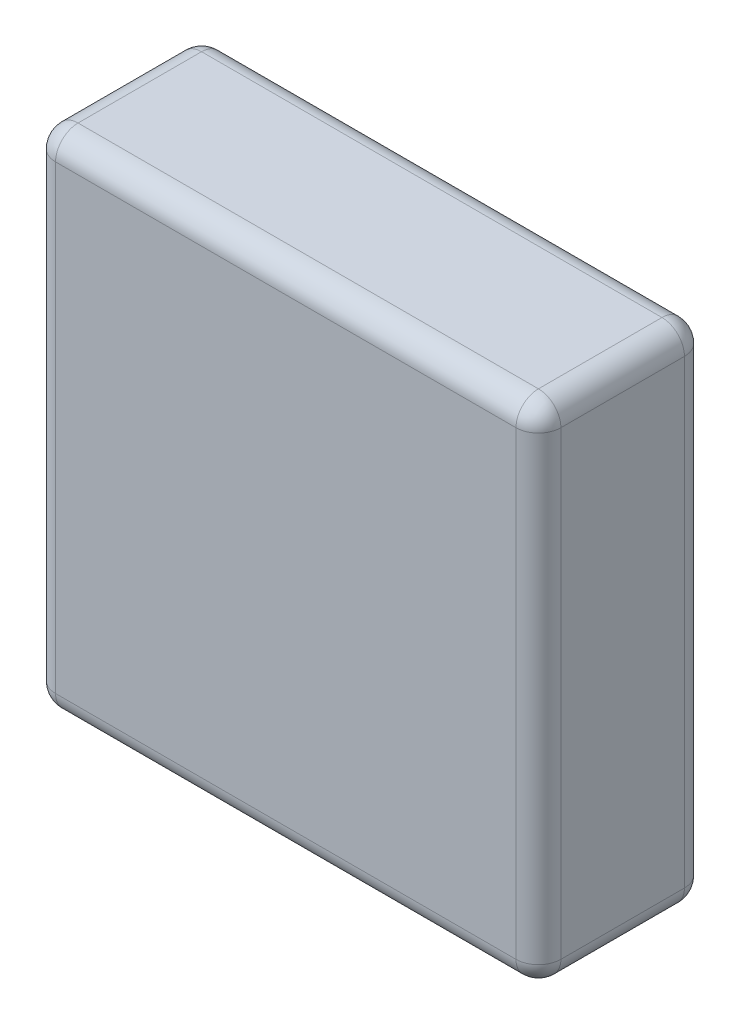
ISO-10303-21;
HEADER;
FILE_DESCRIPTION(('STEP AP214'),'2;1');
FILE_NAME('part.step','',(''),(''),'','','');
FILE_SCHEMA(('AUTOMOTIVE_DESIGN { 1 0 10303 214 1 1 1 1 }'));
ENDSEC;
DATA;
#1=APPLICATION_CONTEXT('core data for automotive mechanical design processes');
#2=APPLICATION_PROTOCOL_DEFINITION('international standard','automotive_design',2000,#1);
#3=PRODUCT_CONTEXT('',#1,'mechanical');
#4=PRODUCT('Part','Part','',(#3));
#5=PRODUCT_RELATED_PRODUCT_CATEGORY('part','',(#4));
#6=PRODUCT_DEFINITION_FORMATION('','',#4);
#7=PRODUCT_DEFINITION_CONTEXT('part definition',#1,'design');
#8=PRODUCT_DEFINITION('design','',#6,#7);
#9=PRODUCT_DEFINITION_SHAPE('','',#8);
#10=(LENGTH_UNIT() NAMED_UNIT(*) SI_UNIT(.MILLI.,.METRE.));
#11=(NAMED_UNIT(*) PLANE_ANGLE_UNIT() SI_UNIT($,.RADIAN.));
#12=(NAMED_UNIT(*) SI_UNIT($,.STERADIAN.) SOLID_ANGLE_UNIT());
#13=UNCERTAINTY_MEASURE_WITH_UNIT(LENGTH_MEASURE(1.E-05),#10,'distance_accuracy_value','');
#14=(GEOMETRIC_REPRESENTATION_CONTEXT(3) GLOBAL_UNCERTAINTY_ASSIGNED_CONTEXT((#13)) GLOBAL_UNIT_ASSIGNED_CONTEXT((#10,
#11,#12)) REPRESENTATION_CONTEXT('',''));
#15=CARTESIAN_POINT('',(0.,0.,0.));
#16=DIRECTION('',(0.,0.,1.));
#17=DIRECTION('',(1.,0.,0.));
#18=AXIS2_PLACEMENT_3D('',#15,#16,#17);
#19=CARTESIAN_POINT('',(45.,-45.,30.));
#20=DIRECTION('',(-1.,0.,0.));
#21=DIRECTION('',(0.,0.,1.));
#22=AXIS2_PLACEMENT_3D('',#19,#20,#21);
#23=PLANE('',#22);
#24=DIRECTION('',(0.,0.,-1.));
#25=VECTOR('',#24,1.);
#26=CARTESIAN_POINT('',(45.,-41.,30.));
#27=LINE('',#26,#25);
#28=CARTESIAN_POINT('',(45.,-41.,26.));
#29=VERTEX_POINT('',#28);
#30=CARTESIAN_POINT('',(45.,-41.,4.));
#31=VERTEX_POINT('',#30);
#32=EDGE_CURVE('E200',#29,#31,#27,.T.);
#33=ORIENTED_EDGE('',*,*,#32,.T.);
#34=DIRECTION('',(0.,1.,0.));
#35=VECTOR('',#34,1.);
#36=CARTESIAN_POINT('',(45.,45.,4.));
#37=LINE('',#36,#35);
#38=CARTESIAN_POINT('',(45.,41.,4.));
#39=VERTEX_POINT('',#38);
#40=EDGE_CURVE('E207',#31,#39,#37,.T.);
#41=ORIENTED_EDGE('',*,*,#40,.T.);
#42=DIRECTION('',(0.,0.,-1.));
#43=VECTOR('',#42,1.);
#44=CARTESIAN_POINT('',(45.,41.,30.));
#45=LINE('',#44,#43);
#46=CARTESIAN_POINT('',(45.,41.,26.));
#47=VERTEX_POINT('',#46);
#48=EDGE_CURVE('E203',#39,#47,#45,.F.);
#49=ORIENTED_EDGE('',*,*,#48,.T.);
#50=DIRECTION('',(0.,1.,0.));
#51=VECTOR('',#50,1.);
#52=CARTESIAN_POINT('',(45.,-45.,26.));
#53=LINE('',#52,#51);
#54=EDGE_CURVE('E197',#47,#29,#53,.F.);
#55=ORIENTED_EDGE('',*,*,#54,.T.);
#56=EDGE_LOOP('',(#33,#41,#49,#55));
#57=FACE_BOUND('',#56,.T.);
#58=ADVANCED_FACE('F45',(#57),#23,.F.);
#59=CARTESIAN_POINT('',(-45.,45.,30.));
#60=DIRECTION('',(0.,-1.,0.));
#61=DIRECTION('',(0.,0.,-1.));
#62=AXIS2_PLACEMENT_3D('',#59,#60,#61);
#63=PLANE('',#62);
#64=DIRECTION('',(0.,0.,-1.));
#65=VECTOR('',#64,1.);
#66=CARTESIAN_POINT('',(41.,45.,30.));
#67=LINE('',#66,#65);
#68=CARTESIAN_POINT('',(41.,45.,26.));
#69=VERTEX_POINT('',#68);
#70=CARTESIAN_POINT('',(41.,45.,4.));
#71=VERTEX_POINT('',#70);
#72=EDGE_CURVE('E187',#69,#71,#67,.T.);
#73=ORIENTED_EDGE('',*,*,#72,.T.);
#74=DIRECTION('',(-1.,0.,0.));
#75=VECTOR('',#74,1.);
#76=CARTESIAN_POINT('',(-45.,45.,4.));
#77=LINE('',#76,#75);
#78=CARTESIAN_POINT('',(-41.,45.,4.));
#79=VERTEX_POINT('',#78);
#80=EDGE_CURVE('E194',#71,#79,#77,.T.);
#81=ORIENTED_EDGE('',*,*,#80,.T.);
#82=DIRECTION('',(0.,0.,-1.));
#83=VECTOR('',#82,1.);
#84=CARTESIAN_POINT('',(-41.,45.,30.));
#85=LINE('',#84,#83);
#86=CARTESIAN_POINT('',(-41.,45.,26.));
#87=VERTEX_POINT('',#86);
#88=EDGE_CURVE('E190',#79,#87,#85,.F.);
#89=ORIENTED_EDGE('',*,*,#88,.T.);
#90=DIRECTION('',(-1.,0.,0.));
#91=VECTOR('',#90,1.);
#92=CARTESIAN_POINT('',(-45.,45.,26.));
#93=LINE('',#92,#91);
#94=EDGE_CURVE('E184',#87,#69,#93,.F.);
#95=ORIENTED_EDGE('',*,*,#94,.T.);
#96=EDGE_LOOP('',(#73,#81,#89,#95));
#97=FACE_BOUND('',#96,.T.);
#98=ADVANCED_FACE('F364',(#97),#63,.F.);
#99=CARTESIAN_POINT('',(-45.,-45.,30.));
#100=DIRECTION('',(1.,0.,0.));
#101=DIRECTION('',(0.,0.,-1.));
#102=AXIS2_PLACEMENT_3D('',#99,#100,#101);
#103=PLANE('',#102);
#104=DIRECTION('',(0.,0.,-1.));
#105=VECTOR('',#104,1.);
#106=CARTESIAN_POINT('',(-45.,41.,30.));
#107=LINE('',#106,#105);
#108=CARTESIAN_POINT('',(-45.,41.,26.));
#109=VERTEX_POINT('',#108);
#110=CARTESIAN_POINT('',(-45.,41.,4.));
#111=VERTEX_POINT('',#110);
#112=EDGE_CURVE('E146',#109,#111,#107,.T.);
#113=ORIENTED_EDGE('',*,*,#112,.T.);
#114=DIRECTION('',(0.,-1.,0.));
#115=VECTOR('',#114,1.);
#116=CARTESIAN_POINT('',(-45.,-45.,4.));
#117=LINE('',#116,#115);
#118=CARTESIAN_POINT('',(-45.,-41.,4.));
#119=VERTEX_POINT('',#118);
#120=EDGE_CURVE('E141',#111,#119,#117,.T.);
#121=ORIENTED_EDGE('',*,*,#120,.T.);
#122=DIRECTION('',(0.,0.,-1.));
#123=VECTOR('',#122,1.);
#124=CARTESIAN_POINT('',(-45.,-41.,30.));
#125=LINE('',#124,#123);
#126=CARTESIAN_POINT('',(-45.,-41.,26.));
#127=VERTEX_POINT('',#126);
#128=EDGE_CURVE('E133',#119,#127,#125,.F.);
#129=ORIENTED_EDGE('',*,*,#128,.T.);
#130=DIRECTION('',(0.,-1.,0.));
#131=VECTOR('',#130,1.);
#132=CARTESIAN_POINT('',(-45.,-45.,26.));
#133=LINE('',#132,#131);
#134=EDGE_CURVE('E138',#127,#109,#133,.F.);
#135=ORIENTED_EDGE('',*,*,#134,.T.);
#136=EDGE_LOOP('',(#113,#121,#129,#135));
#137=FACE_BOUND('',#136,.T.);
#138=ADVANCED_FACE('F136',(#137),#103,.F.);
#139=CARTESIAN_POINT('',(-45.,-45.,30.));
#140=DIRECTION('',(0.,1.,0.));
#141=DIRECTION('',(0.,0.,1.));
#142=AXIS2_PLACEMENT_3D('',#139,#140,#141);
#143=PLANE('',#142);
#144=DIRECTION('',(0.,0.,-1.));
#145=VECTOR('',#144,1.);
#146=CARTESIAN_POINT('',(-41.,-45.,30.));
#147=LINE('',#146,#145);
#148=CARTESIAN_POINT('',(-41.,-45.,26.));
#149=VERTEX_POINT('',#148);
#150=CARTESIAN_POINT('',(-41.,-45.,4.));
#151=VERTEX_POINT('',#150);
#152=EDGE_CURVE('E154',#149,#151,#147,.T.);
#153=ORIENTED_EDGE('',*,*,#152,.T.);
#154=DIRECTION('',(1.,0.,0.));
#155=VECTOR('',#154,1.);
#156=CARTESIAN_POINT('',(45.,-45.,4.));
#157=LINE('',#156,#155);
#158=CARTESIAN_POINT('',(41.,-45.,4.));
#159=VERTEX_POINT('',#158);
#160=EDGE_CURVE('E218',#151,#159,#157,.T.);
#161=ORIENTED_EDGE('',*,*,#160,.T.);
#162=DIRECTION('',(0.,0.,-1.));
#163=VECTOR('',#162,1.);
#164=CARTESIAN_POINT('',(41.,-45.,30.));
#165=LINE('',#164,#163);
#166=CARTESIAN_POINT('',(41.,-45.,26.));
#167=VERTEX_POINT('',#166);
#168=EDGE_CURVE('E213',#159,#167,#165,.F.);
#169=ORIENTED_EDGE('',*,*,#168,.T.);
#170=DIRECTION('',(1.,0.,0.));
#171=VECTOR('',#170,1.);
#172=CARTESIAN_POINT('',(-45.,-45.,26.));
#173=LINE('',#172,#171);
#174=EDGE_CURVE('E210',#167,#149,#173,.F.);
#175=ORIENTED_EDGE('',*,*,#174,.T.);
#176=EDGE_LOOP('',(#153,#161,#169,#175));
#177=FACE_BOUND('',#176,.T.);
#178=ADVANCED_FACE('F355',(#177),#143,.F.);
#179=CARTESIAN_POINT('',(0.,0.,30.));
#180=DIRECTION('',(0.,0.,-1.));
#181=DIRECTION('',(-1.,0.,0.));
#182=AXIS2_PLACEMENT_3D('',#179,#180,#181);
#183=PLANE('',#182);
#184=DIRECTION('',(0.,-1.,0.));
#185=VECTOR('',#184,1.);
#186=CARTESIAN_POINT('',(-41.,0.,30.));
#187=LINE('',#186,#185);
#188=CARTESIAN_POINT('',(-41.,41.,30.));
#189=VERTEX_POINT('',#188);
#190=CARTESIAN_POINT('',(-41.,-41.,30.));
#191=VERTEX_POINT('',#190);
#192=EDGE_CURVE('E55',#189,#191,#187,.T.);
#193=ORIENTED_EDGE('',*,*,#192,.T.);
#194=DIRECTION('',(1.,0.,0.));
#195=VECTOR('',#194,1.);
#196=CARTESIAN_POINT('',(0.,-41.,30.));
#197=LINE('',#196,#195);
#198=CARTESIAN_POINT('',(41.,-41.,30.));
#199=VERTEX_POINT('',#198);
#200=EDGE_CURVE('E11',#191,#199,#197,.T.);
#201=ORIENTED_EDGE('',*,*,#200,.T.);
#202=DIRECTION('',(0.,1.,0.));
#203=VECTOR('',#202,1.);
#204=CARTESIAN_POINT('',(41.,0.,30.));
#205=LINE('',#204,#203);
#206=CARTESIAN_POINT('',(41.,41.,30.));
#207=VERTEX_POINT('',#206);
#208=EDGE_CURVE('E234',#199,#207,#205,.T.);
#209=ORIENTED_EDGE('',*,*,#208,.T.);
#210=DIRECTION('',(-1.,0.,0.));
#211=VECTOR('',#210,1.);
#212=CARTESIAN_POINT('',(0.,41.,30.));
#213=LINE('',#212,#211);
#214=EDGE_CURVE('E66',#207,#189,#213,.T.);
#215=ORIENTED_EDGE('',*,*,#214,.T.);
#216=EDGE_LOOP('',(#193,#201,#209,#215));
#217=FACE_BOUND('',#216,.T.);
#218=ADVANCED_FACE('F357',(#217),#183,.F.);
#219=CARTESIAN_POINT('',(0.,0.,0.));
#220=DIRECTION('',(0.,0.,-1.));
#221=DIRECTION('',(-1.,0.,0.));
#222=AXIS2_PLACEMENT_3D('',#219,#220,#221);
#223=PLANE('',#222);
#224=DIRECTION('',(0.,-1.,0.));
#225=VECTOR('',#224,1.);
#226=CARTESIAN_POINT('',(-41.,45.,0.));
#227=LINE('',#226,#225);
#228=CARTESIAN_POINT('',(-41.,-41.,0.));
#229=VERTEX_POINT('',#228);
#230=CARTESIAN_POINT('',(-41.,41.,0.));
#231=VERTEX_POINT('',#230);
#232=EDGE_CURVE('E227',#229,#231,#227,.F.);
#233=ORIENTED_EDGE('',*,*,#232,.T.);
#234=DIRECTION('',(-1.,0.,0.));
#235=VECTOR('',#234,1.);
#236=CARTESIAN_POINT('',(45.,41.,0.));
#237=LINE('',#236,#235);
#238=CARTESIAN_POINT('',(41.,41.,0.));
#239=VERTEX_POINT('',#238);
#240=EDGE_CURVE('E230',#231,#239,#237,.F.);
#241=ORIENTED_EDGE('',*,*,#240,.T.);
#242=DIRECTION('',(0.,1.,0.));
#243=VECTOR('',#242,1.);
#244=CARTESIAN_POINT('',(41.,-45.,0.));
#245=LINE('',#244,#243);
#246=CARTESIAN_POINT('',(41.,-41.,0.));
#247=VERTEX_POINT('',#246);
#248=EDGE_CURVE('E221',#239,#247,#245,.F.);
#249=ORIENTED_EDGE('',*,*,#248,.T.);
#250=DIRECTION('',(1.,0.,0.));
#251=VECTOR('',#250,1.);
#252=CARTESIAN_POINT('',(-45.,-41.,0.));
#253=LINE('',#252,#251);
#254=EDGE_CURVE('E224',#247,#229,#253,.F.);
#255=ORIENTED_EDGE('',*,*,#254,.T.);
#256=EDGE_LOOP('',(#233,#241,#249,#255));
#257=FACE_BOUND('',#256,.T.);
#258=ADVANCED_FACE('F325',(#257),#223,.T.);
#259=CARTESIAN_POINT('',(41.,-41.,30.));
#260=DIRECTION('',(0.,0.,-1.));
#261=DIRECTION('',(-1.,0.,0.));
#262=AXIS2_PLACEMENT_3D('',#259,#260,#261);
#263=CYLINDRICAL_SURFACE('',#262,4.);
#264=CARTESIAN_POINT('',(41.,-41.,26.));
#265=DIRECTION('',(0.,0.,1.));
#266=DIRECTION('',(1.,0.,0.));
#267=AXIS2_PLACEMENT_3D('',#264,#265,#266);
#268=CIRCLE('',#267,4.);
#269=EDGE_CURVE('E49',#167,#29,#268,.T.);
#270=ORIENTED_EDGE('',*,*,#269,.F.);
#271=ORIENTED_EDGE('',*,*,#168,.F.);
#272=CARTESIAN_POINT('',(41.,-41.,4.));
#273=DIRECTION('',(0.,0.,-1.));
#274=DIRECTION('',(-1.,0.,0.));
#275=AXIS2_PLACEMENT_3D('',#272,#273,#274);
#276=CIRCLE('',#275,4.);
#277=EDGE_CURVE('E178',#31,#159,#276,.T.);
#278=ORIENTED_EDGE('',*,*,#277,.F.);
#279=ORIENTED_EDGE('',*,*,#32,.F.);
#280=EDGE_LOOP('',(#270,#271,#278,#279));
#281=FACE_BOUND('',#280,.T.);
#282=ADVANCED_FACE('F47',(#281),#263,.T.);
#283=CARTESIAN_POINT('',(41.,-41.,26.));
#284=DIRECTION('',(1.,0.,0.));
#285=DIRECTION('',(0.,0.,-1.));
#286=AXIS2_PLACEMENT_3D('',#283,#284,#285);
#287=SPHERICAL_SURFACE('',#286,4.);
#288=CARTESIAN_POINT('',(41.,-41.,26.));
#289=DIRECTION('',(1.,0.,0.));
#290=DIRECTION('',(0.,0.,-1.));
#291=AXIS2_PLACEMENT_3D('',#288,#289,#290);
#292=CIRCLE('',#291,4.);
#293=EDGE_CURVE('E300',#167,#199,#292,.F.);
#294=ORIENTED_EDGE('',*,*,#293,.F.);
#295=ORIENTED_EDGE('',*,*,#269,.T.);
#296=CARTESIAN_POINT('',(41.,-41.,26.));
#297=DIRECTION('',(0.,-1.,0.));
#298=DIRECTION('',(0.,0.,-1.));
#299=AXIS2_PLACEMENT_3D('',#296,#297,#298);
#300=CIRCLE('',#299,4.);
#301=EDGE_CURVE('E304',#199,#29,#300,.F.);
#302=ORIENTED_EDGE('',*,*,#301,.F.);
#303=EDGE_LOOP('',(#294,#295,#302));
#304=FACE_BOUND('',#303,.T.);
#305=ADVANCED_FACE('F350',(#304),#287,.T.);
#306=CARTESIAN_POINT('',(41.,-41.,4.));
#307=DIRECTION('',(0.,-1.,0.));
#308=DIRECTION('',(0.,0.,-1.));
#309=AXIS2_PLACEMENT_3D('',#306,#307,#308);
#310=SPHERICAL_SURFACE('',#309,4.);
#311=CARTESIAN_POINT('',(41.,-41.,4.));
#312=DIRECTION('',(0.,-1.,0.));
#313=DIRECTION('',(0.,0.,-1.));
#314=AXIS2_PLACEMENT_3D('',#311,#312,#313);
#315=CIRCLE('',#314,4.);
#316=EDGE_CURVE('E292',#31,#247,#315,.F.);
#317=ORIENTED_EDGE('',*,*,#316,.F.);
#318=ORIENTED_EDGE('',*,*,#277,.T.);
#319=CARTESIAN_POINT('',(41.,-41.,4.));
#320=DIRECTION('',(1.,0.,0.));
#321=DIRECTION('',(0.,0.,-1.));
#322=AXIS2_PLACEMENT_3D('',#319,#320,#321);
#323=CIRCLE('',#322,4.);
#324=EDGE_CURVE('E296',#247,#159,#323,.F.);
#325=ORIENTED_EDGE('',*,*,#324,.F.);
#326=EDGE_LOOP('',(#317,#318,#325));
#327=FACE_BOUND('',#326,.T.);
#328=ADVANCED_FACE('F313',(#327),#310,.T.);
#329=CARTESIAN_POINT('',(41.,0.,26.));
#330=DIRECTION('',(0.,1.,0.));
#331=DIRECTION('',(0.,0.,1.));
#332=AXIS2_PLACEMENT_3D('',#329,#330,#331);
#333=CYLINDRICAL_SURFACE('',#332,4.);
#334=ORIENTED_EDGE('',*,*,#301,.T.);
#335=ORIENTED_EDGE('',*,*,#54,.F.);
#336=CARTESIAN_POINT('',(41.,41.,26.));
#337=DIRECTION('',(0.,1.,0.));
#338=DIRECTION('',(0.,0.,1.));
#339=AXIS2_PLACEMENT_3D('',#336,#337,#338);
#340=CIRCLE('',#339,4.);
#341=EDGE_CURVE('E285',#207,#47,#340,.T.);
#342=ORIENTED_EDGE('',*,*,#341,.F.);
#343=ORIENTED_EDGE('',*,*,#208,.F.);
#344=EDGE_LOOP('',(#334,#335,#342,#343));
#345=FACE_BOUND('',#344,.T.);
#346=ADVANCED_FACE('F345',(#345),#333,.T.);
#347=CARTESIAN_POINT('',(0.,-41.,26.));
#348=DIRECTION('',(1.,0.,0.));
#349=DIRECTION('',(0.,0.,-1.));
#350=AXIS2_PLACEMENT_3D('',#347,#348,#349);
#351=CYLINDRICAL_SURFACE('',#350,4.);
#352=ORIENTED_EDGE('',*,*,#293,.T.);
#353=ORIENTED_EDGE('',*,*,#200,.F.);
#354=CARTESIAN_POINT('',(-41.,-41.,26.));
#355=DIRECTION('',(-1.,0.,0.));
#356=DIRECTION('',(0.,0.,1.));
#357=AXIS2_PLACEMENT_3D('',#354,#355,#356);
#358=CIRCLE('',#357,4.);
#359=EDGE_CURVE('E159',#149,#191,#358,.T.);
#360=ORIENTED_EDGE('',*,*,#359,.F.);
#361=ORIENTED_EDGE('',*,*,#174,.F.);
#362=EDGE_LOOP('',(#352,#353,#360,#361));
#363=FACE_BOUND('',#362,.T.);
#364=ADVANCED_FACE('F353',(#363),#351,.T.);
#365=CARTESIAN_POINT('',(-41.,-41.,30.));
#366=DIRECTION('',(0.,0.,-1.));
#367=DIRECTION('',(-1.,0.,0.));
#368=AXIS2_PLACEMENT_3D('',#365,#366,#367);
#369=CYLINDRICAL_SURFACE('',#368,4.);
#370=CARTESIAN_POINT('',(-41.,-41.,4.));
#371=DIRECTION('',(0.,0.,-1.));
#372=DIRECTION('',(-1.,0.,0.));
#373=AXIS2_PLACEMENT_3D('',#370,#371,#372);
#374=CIRCLE('',#373,4.);
#375=EDGE_CURVE('E160',#151,#119,#374,.T.);
#376=ORIENTED_EDGE('',*,*,#375,.F.);
#377=ORIENTED_EDGE('',*,*,#152,.F.);
#378=CARTESIAN_POINT('',(-41.,-41.,26.));
#379=DIRECTION('',(0.,0.,1.));
#380=DIRECTION('',(1.,0.,0.));
#381=AXIS2_PLACEMENT_3D('',#378,#379,#380);
#382=CIRCLE('',#381,4.);
#383=EDGE_CURVE('E150',#127,#149,#382,.T.);
#384=ORIENTED_EDGE('',*,*,#383,.F.);
#385=ORIENTED_EDGE('',*,*,#128,.F.);
#386=EDGE_LOOP('',(#376,#377,#384,#385));
#387=FACE_BOUND('',#386,.T.);
#388=ADVANCED_FACE('F152',(#387),#369,.T.);
#389=CARTESIAN_POINT('',(-45.,-41.,4.));
#390=DIRECTION('',(-1.,0.,0.));
#391=DIRECTION('',(0.,0.,1.));
#392=AXIS2_PLACEMENT_3D('',#389,#390,#391);
#393=CYLINDRICAL_SURFACE('',#392,4.);
#394=ORIENTED_EDGE('',*,*,#324,.T.);
#395=ORIENTED_EDGE('',*,*,#160,.F.);
#396=CARTESIAN_POINT('',(-41.,-41.,4.));
#397=DIRECTION('',(-1.,0.,0.));
#398=DIRECTION('',(0.,0.,1.));
#399=AXIS2_PLACEMENT_3D('',#396,#397,#398);
#400=CIRCLE('',#399,4.);
#401=EDGE_CURVE('E278',#229,#151,#400,.T.);
#402=ORIENTED_EDGE('',*,*,#401,.F.);
#403=ORIENTED_EDGE('',*,*,#254,.F.);
#404=EDGE_LOOP('',(#394,#395,#402,#403));
#405=FACE_BOUND('',#404,.T.);
#406=ADVANCED_FACE('F321',(#405),#393,.T.);
#407=CARTESIAN_POINT('',(41.,-45.,4.));
#408=DIRECTION('',(0.,-1.,0.));
#409=DIRECTION('',(0.,0.,-1.));
#410=AXIS2_PLACEMENT_3D('',#407,#408,#409);
#411=CYLINDRICAL_SURFACE('',#410,4.);
#412=ORIENTED_EDGE('',*,*,#316,.T.);
#413=ORIENTED_EDGE('',*,*,#248,.F.);
#414=CARTESIAN_POINT('',(41.,41.,4.));
#415=DIRECTION('',(0.,1.,0.));
#416=DIRECTION('',(0.,0.,1.));
#417=AXIS2_PLACEMENT_3D('',#414,#415,#416);
#418=CIRCLE('',#417,4.);
#419=EDGE_CURVE('E274',#39,#239,#418,.T.);
#420=ORIENTED_EDGE('',*,*,#419,.F.);
#421=ORIENTED_EDGE('',*,*,#40,.F.);
#422=EDGE_LOOP('',(#412,#413,#420,#421));
#423=FACE_BOUND('',#422,.T.);
#424=ADVANCED_FACE('F331',(#423),#411,.T.);
#425=CARTESIAN_POINT('',(41.,41.,30.));
#426=DIRECTION('',(0.,0.,-1.));
#427=DIRECTION('',(-1.,0.,0.));
#428=AXIS2_PLACEMENT_3D('',#425,#426,#427);
#429=CYLINDRICAL_SURFACE('',#428,4.);
#430=CARTESIAN_POINT('',(41.,41.,26.));
#431=DIRECTION('',(0.,0.,1.));
#432=DIRECTION('',(1.,0.,0.));
#433=AXIS2_PLACEMENT_3D('',#430,#431,#432);
#434=CIRCLE('',#433,4.);
#435=EDGE_CURVE('E288',#47,#69,#434,.T.);
#436=ORIENTED_EDGE('',*,*,#435,.F.);
#437=ORIENTED_EDGE('',*,*,#48,.F.);
#438=CARTESIAN_POINT('',(41.,41.,4.));
#439=DIRECTION('',(0.,0.,-1.));
#440=DIRECTION('',(-1.,0.,0.));
#441=AXIS2_PLACEMENT_3D('',#438,#439,#440);
#442=CIRCLE('',#441,4.);
#443=EDGE_CURVE('E270',#71,#39,#442,.T.);
#444=ORIENTED_EDGE('',*,*,#443,.F.);
#445=ORIENTED_EDGE('',*,*,#72,.F.);
#446=EDGE_LOOP('',(#436,#437,#444,#445));
#447=FACE_BOUND('',#446,.T.);
#448=ADVANCED_FACE('F337',(#447),#429,.T.);
#449=CARTESIAN_POINT('',(41.,41.,26.));
#450=DIRECTION('',(1.,0.,0.));
#451=DIRECTION('',(0.,0.,-1.));
#452=AXIS2_PLACEMENT_3D('',#449,#450,#451);
#453=SPHERICAL_SURFACE('',#452,4.);
#454=ORIENTED_EDGE('',*,*,#341,.T.);
#455=ORIENTED_EDGE('',*,*,#435,.T.);
#456=CARTESIAN_POINT('',(41.,41.,26.));
#457=DIRECTION('',(1.,0.,0.));
#458=DIRECTION('',(0.,0.,-1.));
#459=AXIS2_PLACEMENT_3D('',#456,#457,#458);
#460=CIRCLE('',#459,4.);
#461=EDGE_CURVE('E167',#207,#69,#460,.F.);
#462=ORIENTED_EDGE('',*,*,#461,.F.);
#463=EDGE_LOOP('',(#454,#455,#462));
#464=FACE_BOUND('',#463,.T.);
#465=ADVANCED_FACE('F411',(#464),#453,.T.);
#466=CARTESIAN_POINT('',(-41.,-41.,26.));
#467=DIRECTION('',(0.,-1.,0.));
#468=DIRECTION('',(0.,0.,-1.));
#469=AXIS2_PLACEMENT_3D('',#466,#467,#468);
#470=SPHERICAL_SURFACE('',#469,4.);
#471=ORIENTED_EDGE('',*,*,#383,.T.);
#472=ORIENTED_EDGE('',*,*,#359,.T.);
#473=CARTESIAN_POINT('',(-41.,-41.,26.));
#474=DIRECTION('',(0.,-1.,0.));
#475=DIRECTION('',(0.,0.,-1.));
#476=AXIS2_PLACEMENT_3D('',#473,#474,#475);
#477=CIRCLE('',#476,4.);
#478=EDGE_CURVE('E163',#127,#191,#477,.F.);
#479=ORIENTED_EDGE('',*,*,#478,.F.);
#480=EDGE_LOOP('',(#471,#472,#479));
#481=FACE_BOUND('',#480,.T.);
#482=ADVANCED_FACE('F164',(#481),#470,.T.);
#483=CARTESIAN_POINT('',(-41.,-41.,4.));
#484=DIRECTION('',(0.,-1.,0.));
#485=DIRECTION('',(0.,0.,-1.));
#486=AXIS2_PLACEMENT_3D('',#483,#484,#485);
#487=SPHERICAL_SURFACE('',#486,4.);
#488=ORIENTED_EDGE('',*,*,#401,.T.);
#489=ORIENTED_EDGE('',*,*,#375,.T.);
#490=CARTESIAN_POINT('',(-41.,-41.,4.));
#491=DIRECTION('',(0.,-1.,0.));
#492=DIRECTION('',(0.,0.,-1.));
#493=AXIS2_PLACEMENT_3D('',#490,#491,#492);
#494=CIRCLE('',#493,4.);
#495=EDGE_CURVE('E168',#229,#119,#494,.F.);
#496=ORIENTED_EDGE('',*,*,#495,.F.);
#497=EDGE_LOOP('',(#488,#489,#496));
#498=FACE_BOUND('',#497,.T.);
#499=ADVANCED_FACE('F404',(#498),#487,.T.);
#500=CARTESIAN_POINT('',(41.,41.,4.));
#501=DIRECTION('',(1.,0.,0.));
#502=DIRECTION('',(0.,0.,-1.));
#503=AXIS2_PLACEMENT_3D('',#500,#501,#502);
#504=SPHERICAL_SURFACE('',#503,4.);
#505=ORIENTED_EDGE('',*,*,#443,.T.);
#506=ORIENTED_EDGE('',*,*,#419,.T.);
#507=CARTESIAN_POINT('',(41.,41.,4.));
#508=DIRECTION('',(1.,0.,0.));
#509=DIRECTION('',(0.,1.,0.));
#510=AXIS2_PLACEMENT_3D('',#507,#508,#509);
#511=CIRCLE('',#510,4.);
#512=EDGE_CURVE('E261',#71,#239,#511,.F.);
#513=ORIENTED_EDGE('',*,*,#512,.F.);
#514=EDGE_LOOP('',(#505,#506,#513));
#515=FACE_BOUND('',#514,.T.);
#516=ADVANCED_FACE('F400',(#515),#504,.T.);
#517=CARTESIAN_POINT('',(0.,41.,26.));
#518=DIRECTION('',(-1.,0.,0.));
#519=DIRECTION('',(0.,0.,1.));
#520=AXIS2_PLACEMENT_3D('',#517,#518,#519);
#521=CYLINDRICAL_SURFACE('',#520,4.);
#522=ORIENTED_EDGE('',*,*,#461,.T.);
#523=ORIENTED_EDGE('',*,*,#94,.F.);
#524=CARTESIAN_POINT('',(-41.,41.,26.));
#525=DIRECTION('',(-1.,0.,0.));
#526=DIRECTION('',(0.,0.,1.));
#527=AXIS2_PLACEMENT_3D('',#524,#525,#526);
#528=CIRCLE('',#527,4.);
#529=EDGE_CURVE('E257',#189,#87,#528,.T.);
#530=ORIENTED_EDGE('',*,*,#529,.F.);
#531=ORIENTED_EDGE('',*,*,#214,.F.);
#532=EDGE_LOOP('',(#522,#523,#530,#531));
#533=FACE_BOUND('',#532,.T.);
#534=ADVANCED_FACE('F397',(#533),#521,.T.);
#535=CARTESIAN_POINT('',(-41.,0.,26.));
#536=DIRECTION('',(0.,-1.,0.));
#537=DIRECTION('',(0.,0.,-1.));
#538=AXIS2_PLACEMENT_3D('',#535,#536,#537);
#539=CYLINDRICAL_SURFACE('',#538,4.);
#540=ORIENTED_EDGE('',*,*,#478,.T.);
#541=ORIENTED_EDGE('',*,*,#192,.F.);
#542=CARTESIAN_POINT('',(-41.,41.,26.));
#543=DIRECTION('',(0.,1.,0.));
#544=DIRECTION('',(0.,0.,1.));
#545=AXIS2_PLACEMENT_3D('',#542,#543,#544);
#546=CIRCLE('',#545,4.);
#547=EDGE_CURVE('E172',#109,#189,#546,.T.);
#548=ORIENTED_EDGE('',*,*,#547,.F.);
#549=ORIENTED_EDGE('',*,*,#134,.F.);
#550=EDGE_LOOP('',(#540,#541,#548,#549));
#551=FACE_BOUND('',#550,.T.);
#552=ADVANCED_FACE('F170',(#551),#539,.T.);
#553=CARTESIAN_POINT('',(-41.,-45.,4.));
#554=DIRECTION('',(0.,1.,0.));
#555=DIRECTION('',(0.,0.,1.));
#556=AXIS2_PLACEMENT_3D('',#553,#554,#555);
#557=CYLINDRICAL_SURFACE('',#556,4.);
#558=ORIENTED_EDGE('',*,*,#495,.T.);
#559=ORIENTED_EDGE('',*,*,#120,.F.);
#560=CARTESIAN_POINT('',(-41.,41.,4.));
#561=DIRECTION('',(0.,1.,0.));
#562=DIRECTION('',(-1.,0.,0.));
#563=AXIS2_PLACEMENT_3D('',#560,#561,#562);
#564=CIRCLE('',#563,4.);
#565=EDGE_CURVE('E251',#231,#111,#564,.T.);
#566=ORIENTED_EDGE('',*,*,#565,.F.);
#567=ORIENTED_EDGE('',*,*,#232,.F.);
#568=EDGE_LOOP('',(#558,#559,#566,#567));
#569=FACE_BOUND('',#568,.T.);
#570=ADVANCED_FACE('F390',(#569),#557,.T.);
#571=CARTESIAN_POINT('',(-45.,41.,4.));
#572=DIRECTION('',(1.,0.,0.));
#573=DIRECTION('',(0.,0.,-1.));
#574=AXIS2_PLACEMENT_3D('',#571,#572,#573);
#575=CYLINDRICAL_SURFACE('',#574,4.);
#576=ORIENTED_EDGE('',*,*,#512,.T.);
#577=ORIENTED_EDGE('',*,*,#240,.F.);
#578=CARTESIAN_POINT('',(-41.,41.,4.));
#579=DIRECTION('',(-1.,0.,0.));
#580=DIRECTION('',(0.,0.,1.));
#581=AXIS2_PLACEMENT_3D('',#578,#579,#580);
#582=CIRCLE('',#581,4.);
#583=EDGE_CURVE('E247',#79,#231,#582,.T.);
#584=ORIENTED_EDGE('',*,*,#583,.F.);
#585=ORIENTED_EDGE('',*,*,#80,.F.);
#586=EDGE_LOOP('',(#576,#577,#584,#585));
#587=FACE_BOUND('',#586,.T.);
#588=ADVANCED_FACE('F386',(#587),#575,.T.);
#589=CARTESIAN_POINT('',(-41.,41.,26.));
#590=DIRECTION('',(0.,0.,1.));
#591=DIRECTION('',(1.,0.,0.));
#592=AXIS2_PLACEMENT_3D('',#589,#590,#591);
#593=SPHERICAL_SURFACE('',#592,4.);
#594=ORIENTED_EDGE('',*,*,#547,.T.);
#595=ORIENTED_EDGE('',*,*,#529,.T.);
#596=CARTESIAN_POINT('',(-41.,41.,26.));
#597=DIRECTION('',(0.,0.,1.));
#598=DIRECTION('',(1.,0.,0.));
#599=AXIS2_PLACEMENT_3D('',#596,#597,#598);
#600=CIRCLE('',#599,4.);
#601=EDGE_CURVE('E244',#109,#87,#600,.F.);
#602=ORIENTED_EDGE('',*,*,#601,.F.);
#603=EDGE_LOOP('',(#594,#595,#602));
#604=FACE_BOUND('',#603,.T.);
#605=ADVANCED_FACE('F382',(#604),#593,.T.);
#606=CARTESIAN_POINT('',(-41.,41.,4.));
#607=DIRECTION('',(0.,0.,-1.));
#608=DIRECTION('',(-1.,0.,0.));
#609=AXIS2_PLACEMENT_3D('',#606,#607,#608);
#610=SPHERICAL_SURFACE('',#609,4.);
#611=ORIENTED_EDGE('',*,*,#583,.T.);
#612=ORIENTED_EDGE('',*,*,#565,.T.);
#613=CARTESIAN_POINT('',(-41.,41.,4.));
#614=DIRECTION('',(0.,0.,-1.));
#615=DIRECTION('',(-1.,0.,0.));
#616=AXIS2_PLACEMENT_3D('',#613,#614,#615);
#617=CIRCLE('',#616,4.);
#618=EDGE_CURVE('E241',#79,#111,#617,.F.);
#619=ORIENTED_EDGE('',*,*,#618,.F.);
#620=EDGE_LOOP('',(#611,#612,#619));
#621=FACE_BOUND('',#620,.T.);
#622=ADVANCED_FACE('F378',(#621),#610,.T.);
#623=CARTESIAN_POINT('',(-41.,41.,30.));
#624=DIRECTION('',(0.,0.,-1.));
#625=DIRECTION('',(-1.,0.,0.));
#626=AXIS2_PLACEMENT_3D('',#623,#624,#625);
#627=CYLINDRICAL_SURFACE('',#626,4.);
#628=ORIENTED_EDGE('',*,*,#601,.T.);
#629=ORIENTED_EDGE('',*,*,#88,.F.);
#630=ORIENTED_EDGE('',*,*,#618,.T.);
#631=ORIENTED_EDGE('',*,*,#112,.F.);
#632=EDGE_LOOP('',(#628,#629,#630,#631));
#633=FACE_BOUND('',#632,.T.);
#634=ADVANCED_FACE('F375',(#633),#627,.T.);
#635=CLOSED_SHELL('',(#58,#98,#138,#178,#218,#258,#282,#305,#328,#346,#364,#388,#406,#424,#448,
#465,#482,#499,#516,#534,#552,#570,#588,#605,#622,#634));
#636=MANIFOLD_SOLID_BREP('B2',#635);
#637=ADVANCED_BREP_SHAPE_REPRESENTATION('',(#18,#636),#14);
#638=SHAPE_DEFINITION_REPRESENTATION(#9,#637);
ENDSEC;
END-ISO-10303-21;
